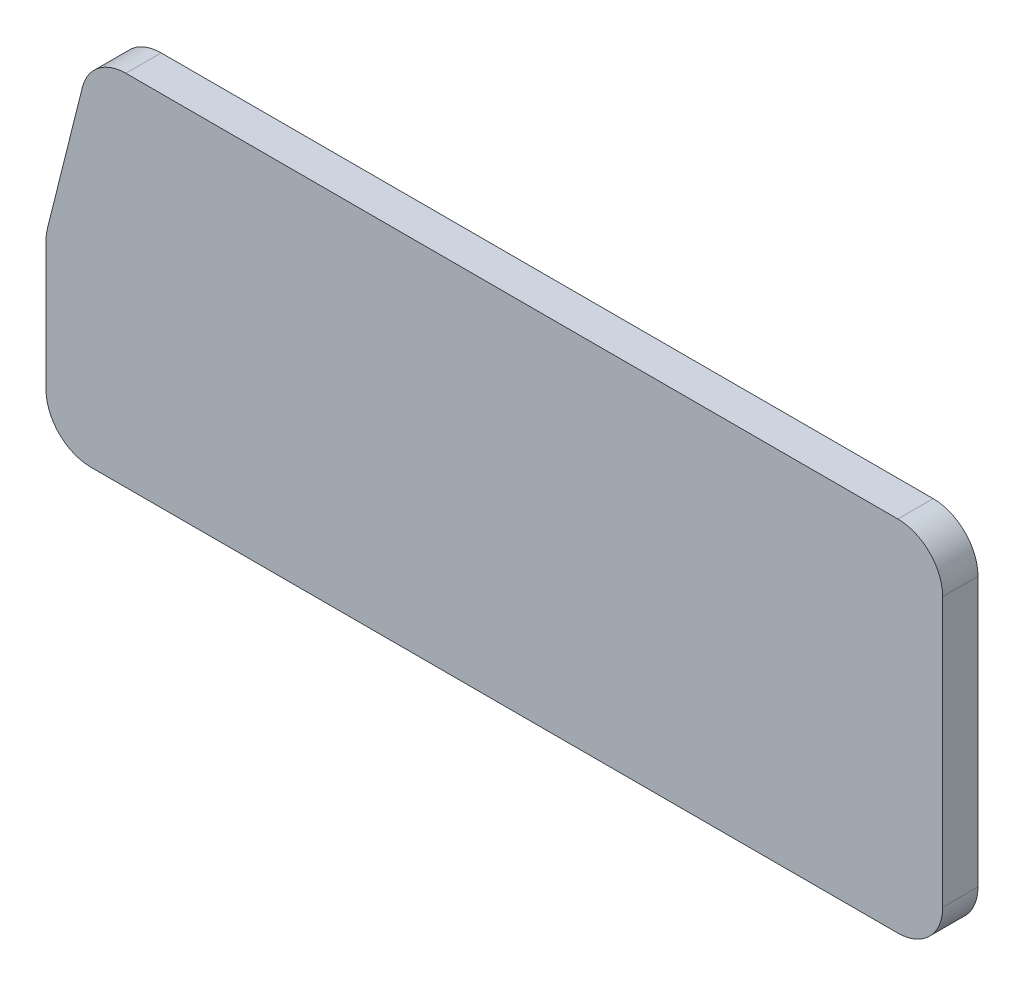
ISO-10303-21;
HEADER;
FILE_DESCRIPTION(('STEP AP214'),'2;1');
FILE_NAME('part.step','',(''),(''),'','','');
FILE_SCHEMA(('AUTOMOTIVE_DESIGN { 1 0 10303 214 1 1 1 1 }'));
ENDSEC;
DATA;
#1=APPLICATION_CONTEXT('core data for automotive mechanical design processes');
#2=APPLICATION_PROTOCOL_DEFINITION('international standard','automotive_design',2000,#1);
#3=PRODUCT_CONTEXT('',#1,'mechanical');
#4=PRODUCT('Part','Part','',(#3));
#5=PRODUCT_RELATED_PRODUCT_CATEGORY('part','',(#4));
#6=PRODUCT_DEFINITION_FORMATION('','',#4);
#7=PRODUCT_DEFINITION_CONTEXT('part definition',#1,'design');
#8=PRODUCT_DEFINITION('design','',#6,#7);
#9=PRODUCT_DEFINITION_SHAPE('','',#8);
#10=(LENGTH_UNIT() NAMED_UNIT(*) SI_UNIT(.MILLI.,.METRE.));
#11=(NAMED_UNIT(*) PLANE_ANGLE_UNIT() SI_UNIT($,.RADIAN.));
#12=(NAMED_UNIT(*) SI_UNIT($,.STERADIAN.) SOLID_ANGLE_UNIT());
#13=UNCERTAINTY_MEASURE_WITH_UNIT(LENGTH_MEASURE(1.E-05),#10,'distance_accuracy_value','');
#14=(GEOMETRIC_REPRESENTATION_CONTEXT(3) GLOBAL_UNCERTAINTY_ASSIGNED_CONTEXT((#13)) GLOBAL_UNIT_ASSIGNED_CONTEXT((#10,
#11,#12)) REPRESENTATION_CONTEXT('',''));
#15=CARTESIAN_POINT('',(0.,0.,0.));
#16=DIRECTION('',(0.,0.,1.));
#17=DIRECTION('',(1.,0.,0.));
#18=AXIS2_PLACEMENT_3D('',#15,#16,#17);
#19=CARTESIAN_POINT('',(63.5,-25.4,2.5));
#20=DIRECTION('',(-1.,0.,0.));
#21=DIRECTION('',(0.,0.,1.));
#22=AXIS2_PLACEMENT_3D('',#19,#20,#21);
#23=PLANE('',#22);
#24=DIRECTION('',(0.,1.,0.));
#25=VECTOR('',#24,1.);
#26=CARTESIAN_POINT('',(63.5,-25.4,-2.5));
#27=LINE('',#26,#25);
#28=CARTESIAN_POINT('',(63.5,-19.05,-2.5));
#29=VERTEX_POINT('',#28);
#30=CARTESIAN_POINT('',(63.5,19.05,-2.5));
#31=VERTEX_POINT('',#30);
#32=EDGE_CURVE('E142',#29,#31,#27,.T.);
#33=ORIENTED_EDGE('',*,*,#32,.T.);
#34=DIRECTION('',(0.,0.,-1.));
#35=VECTOR('',#34,1.);
#36=CARTESIAN_POINT('',(63.5,19.05,2.5));
#37=LINE('',#36,#35);
#38=CARTESIAN_POINT('',(63.5,19.05,2.5));
#39=VERTEX_POINT('',#38);
#40=EDGE_CURVE('E176',#31,#39,#37,.F.);
#41=ORIENTED_EDGE('',*,*,#40,.T.);
#42=DIRECTION('',(0.,1.,0.));
#43=VECTOR('',#42,1.);
#44=CARTESIAN_POINT('',(63.5,-25.4,2.5));
#45=LINE('',#44,#43);
#46=CARTESIAN_POINT('',(63.5,-19.05,2.5));
#47=VERTEX_POINT('',#46);
#48=EDGE_CURVE('E147',#47,#39,#45,.T.);
#49=ORIENTED_EDGE('',*,*,#48,.F.);
#50=DIRECTION('',(0.,0.,-1.));
#51=VECTOR('',#50,1.);
#52=CARTESIAN_POINT('',(63.5,-19.05,2.5));
#53=LINE('',#52,#51);
#54=EDGE_CURVE('E173',#47,#29,#53,.T.);
#55=ORIENTED_EDGE('',*,*,#54,.T.);
#56=EDGE_LOOP('',(#33,#41,#49,#55));
#57=FACE_BOUND('',#56,.T.);
#58=ADVANCED_FACE('F33',(#57),#23,.F.);
#59=CARTESIAN_POINT('',(-57.15,25.4,2.5));
#60=DIRECTION('',(0.,-1.,0.));
#61=DIRECTION('',(0.,0.,-1.));
#62=AXIS2_PLACEMENT_3D('',#59,#60,#61);
#63=PLANE('',#62);
#64=DIRECTION('',(-1.,0.,0.));
#65=VECTOR('',#64,1.);
#66=CARTESIAN_POINT('',(-57.15,25.4,-2.5));
#67=LINE('',#66,#65);
#68=CARTESIAN_POINT('',(57.15,25.4,-2.5));
#69=VERTEX_POINT('',#68);
#70=CARTESIAN_POINT('',(-52.1920698193319,25.4,-2.5));
#71=VERTEX_POINT('',#70);
#72=EDGE_CURVE('E137',#69,#71,#67,.T.);
#73=ORIENTED_EDGE('',*,*,#72,.T.);
#74=DIRECTION('',(0.,0.,-1.));
#75=VECTOR('',#74,1.);
#76=CARTESIAN_POINT('',(-52.1920698193319,25.4,2.5));
#77=LINE('',#76,#75);
#78=CARTESIAN_POINT('',(-52.1920698193319,25.4,2.5));
#79=VERTEX_POINT('',#78);
#80=EDGE_CURVE('E115',#71,#79,#77,.F.);
#81=ORIENTED_EDGE('',*,*,#80,.T.);
#82=DIRECTION('',(-1.,0.,0.));
#83=VECTOR('',#82,1.);
#84=CARTESIAN_POINT('',(-57.15,25.4,2.5));
#85=LINE('',#84,#83);
#86=CARTESIAN_POINT('',(57.15,25.4,2.5));
#87=VERTEX_POINT('',#86);
#88=EDGE_CURVE('E193',#87,#79,#85,.T.);
#89=ORIENTED_EDGE('',*,*,#88,.F.);
#90=DIRECTION('',(0.,0.,-1.));
#91=VECTOR('',#90,1.);
#92=CARTESIAN_POINT('',(57.15,25.4,2.5));
#93=LINE('',#92,#91);
#94=EDGE_CURVE('E120',#87,#69,#93,.T.);
#95=ORIENTED_EDGE('',*,*,#94,.T.);
#96=EDGE_LOOP('',(#73,#81,#89,#95));
#97=FACE_BOUND('',#96,.T.);
#98=ADVANCED_FACE('F213',(#97),#63,.F.);
#99=CARTESIAN_POINT('',(-63.5,-1.85788884277116E-12,2.5));
#100=DIRECTION('',(0.970142500145336,-0.242535625036315,0.));
#101=DIRECTION('',(0.242535625036315,0.970142500145336,0.));
#102=AXIS2_PLACEMENT_3D('',#99,#100,#101);
#103=PLANE('',#102);
#104=DIRECTION('',(-0.242535625036315,-0.970142500145336,0.));
#105=VECTOR('',#104,1.);
#106=CARTESIAN_POINT('',(-63.5,-1.85788884277116E-12,2.5));
#107=LINE('',#106,#105);
#108=CARTESIAN_POINT('',(-58.3524746952548,20.5901012189806,2.5));
#109=VERTEX_POINT('',#108);
#110=CARTESIAN_POINT('',(-63.3104048759229,0.758380496306668,2.5));
#111=VERTEX_POINT('',#110);
#112=EDGE_CURVE('E130',#109,#111,#107,.T.);
#113=ORIENTED_EDGE('',*,*,#112,.F.);
#114=DIRECTION('',(0.,0.,-1.));
#115=VECTOR('',#114,1.);
#116=CARTESIAN_POINT('',(-58.3524746952548,20.5901012189806,2.5));
#117=LINE('',#116,#115);
#118=CARTESIAN_POINT('',(-58.3524746952548,20.5901012189806,-2.5));
#119=VERTEX_POINT('',#118);
#120=EDGE_CURVE('E114',#109,#119,#117,.T.);
#121=ORIENTED_EDGE('',*,*,#120,.T.);
#122=DIRECTION('',(-0.242535625036315,-0.970142500145336,0.));
#123=VECTOR('',#122,1.);
#124=CARTESIAN_POINT('',(-63.5,-1.85788884277116E-12,-2.5));
#125=LINE('',#124,#123);
#126=CARTESIAN_POINT('',(-63.3104048759229,0.758380496306668,-2.5));
#127=VERTEX_POINT('',#126);
#128=EDGE_CURVE('E127',#119,#127,#125,.T.);
#129=ORIENTED_EDGE('',*,*,#128,.T.);
#130=DIRECTION('',(0.,0.,-1.));
#131=VECTOR('',#130,1.);
#132=CARTESIAN_POINT('',(-63.3104048759229,0.75838049630667,2.5));
#133=LINE('',#132,#131);
#134=EDGE_CURVE('E132',#127,#111,#133,.F.);
#135=ORIENTED_EDGE('',*,*,#134,.T.);
#136=EDGE_LOOP('',(#113,#121,#129,#135));
#137=FACE_BOUND('',#136,.T.);
#138=ADVANCED_FACE('F126',(#137),#103,.F.);
#139=CARTESIAN_POINT('',(-63.5,-25.4,2.5));
#140=DIRECTION('',(1.,0.,0.));
#141=DIRECTION('',(0.,1.,0.));
#142=AXIS2_PLACEMENT_3D('',#139,#140,#141);
#143=PLANE('',#142);
#144=DIRECTION('',(0.,-1.,0.));
#145=VECTOR('',#144,1.);
#146=CARTESIAN_POINT('',(-63.5,-25.4,2.5));
#147=LINE('',#146,#145);
#148=CARTESIAN_POINT('',(-63.5,-0.781720722673927,2.5));
#149=VERTEX_POINT('',#148);
#150=CARTESIAN_POINT('',(-63.5,-19.05,2.5));
#151=VERTEX_POINT('',#150);
#152=EDGE_CURVE('E199',#149,#151,#147,.T.);
#153=ORIENTED_EDGE('',*,*,#152,.F.);
#154=DIRECTION('',(0.,0.,-1.));
#155=VECTOR('',#154,1.);
#156=CARTESIAN_POINT('',(-63.5,-0.781720722673927,2.5));
#157=LINE('',#156,#155);
#158=CARTESIAN_POINT('',(-63.5,-0.781720722673927,-2.5));
#159=VERTEX_POINT('',#158);
#160=EDGE_CURVE('E170',#149,#159,#157,.T.);
#161=ORIENTED_EDGE('',*,*,#160,.T.);
#162=DIRECTION('',(0.,-1.,0.));
#163=VECTOR('',#162,1.);
#164=CARTESIAN_POINT('',(-63.5,-25.4,-2.5));
#165=LINE('',#164,#163);
#166=CARTESIAN_POINT('',(-63.5,-19.05,-2.5));
#167=VERTEX_POINT('',#166);
#168=EDGE_CURVE('E136',#159,#167,#165,.T.);
#169=ORIENTED_EDGE('',*,*,#168,.T.);
#170=DIRECTION('',(0.,0.,-1.));
#171=VECTOR('',#170,1.);
#172=CARTESIAN_POINT('',(-63.5,-19.05,2.5));
#173=LINE('',#172,#171);
#174=EDGE_CURVE('E168',#167,#151,#173,.F.);
#175=ORIENTED_EDGE('',*,*,#174,.T.);
#176=EDGE_LOOP('',(#153,#161,#169,#175));
#177=FACE_BOUND('',#176,.T.);
#178=ADVANCED_FACE('F210',(#177),#143,.F.);
#179=CARTESIAN_POINT('',(-63.5,-25.4,2.5));
#180=DIRECTION('',(0.,1.,0.));
#181=DIRECTION('',(0.,0.,1.));
#182=AXIS2_PLACEMENT_3D('',#179,#180,#181);
#183=PLANE('',#182);
#184=DIRECTION('',(1.,0.,0.));
#185=VECTOR('',#184,1.);
#186=CARTESIAN_POINT('',(-63.5,-25.4,-2.5));
#187=LINE('',#186,#185);
#188=CARTESIAN_POINT('',(-57.15,-25.4,-2.5));
#189=VERTEX_POINT('',#188);
#190=CARTESIAN_POINT('',(57.15,-25.4,-2.5));
#191=VERTEX_POINT('',#190);
#192=EDGE_CURVE('E140',#189,#191,#187,.T.);
#193=ORIENTED_EDGE('',*,*,#192,.T.);
#194=DIRECTION('',(0.,0.,-1.));
#195=VECTOR('',#194,1.);
#196=CARTESIAN_POINT('',(57.15,-25.4,2.5));
#197=LINE('',#196,#195);
#198=CARTESIAN_POINT('',(57.15,-25.4,2.5));
#199=VERTEX_POINT('',#198);
#200=EDGE_CURVE('E11',#191,#199,#197,.F.);
#201=ORIENTED_EDGE('',*,*,#200,.T.);
#202=DIRECTION('',(1.,0.,0.));
#203=VECTOR('',#202,1.);
#204=CARTESIAN_POINT('',(-63.5,-25.4,2.5));
#205=LINE('',#204,#203);
#206=CARTESIAN_POINT('',(-57.15,-25.4,2.5));
#207=VERTEX_POINT('',#206);
#208=EDGE_CURVE('E148',#207,#199,#205,.T.);
#209=ORIENTED_EDGE('',*,*,#208,.F.);
#210=DIRECTION('',(0.,0.,-1.));
#211=VECTOR('',#210,1.);
#212=CARTESIAN_POINT('',(-57.15,-25.4,2.5));
#213=LINE('',#212,#211);
#214=EDGE_CURVE('E41',#207,#189,#213,.T.);
#215=ORIENTED_EDGE('',*,*,#214,.T.);
#216=EDGE_LOOP('',(#193,#201,#209,#215));
#217=FACE_BOUND('',#216,.T.);
#218=ADVANCED_FACE('F180',(#217),#183,.F.);
#219=CARTESIAN_POINT('',(0.,0.,2.5));
#220=DIRECTION('',(0.,0.,-1.));
#221=DIRECTION('',(-1.,0.,0.));
#222=AXIS2_PLACEMENT_3D('',#219,#220,#221);
#223=PLANE('',#222);
#224=ORIENTED_EDGE('',*,*,#88,.T.);
#225=CARTESIAN_POINT('',(-52.1920698193319,19.05,2.5));
#226=DIRECTION('',(0.,0.,-1.));
#227=DIRECTION('',(-1.,0.,0.));
#228=AXIS2_PLACEMENT_3D('',#225,#226,#227);
#229=CIRCLE('',#228,6.35);
#230=EDGE_CURVE('E166',#79,#109,#229,.F.);
#231=ORIENTED_EDGE('',*,*,#230,.T.);
#232=ORIENTED_EDGE('',*,*,#112,.T.);
#233=CARTESIAN_POINT('',(-57.15,-0.781720722673934,2.5));
#234=DIRECTION('',(0.,0.,-1.));
#235=DIRECTION('',(-1.,0.,0.));
#236=AXIS2_PLACEMENT_3D('',#233,#234,#235);
#237=CIRCLE('',#236,6.35);
#238=EDGE_CURVE('E164',#111,#149,#237,.F.);
#239=ORIENTED_EDGE('',*,*,#238,.T.);
#240=ORIENTED_EDGE('',*,*,#152,.T.);
#241=CARTESIAN_POINT('',(-57.15,-19.05,2.5));
#242=DIRECTION('',(0.,0.,-1.));
#243=DIRECTION('',(-1.,0.,0.));
#244=AXIS2_PLACEMENT_3D('',#241,#242,#243);
#245=CIRCLE('',#244,6.35);
#246=EDGE_CURVE('E53',#151,#207,#245,.F.);
#247=ORIENTED_EDGE('',*,*,#246,.T.);
#248=ORIENTED_EDGE('',*,*,#208,.T.);
#249=CARTESIAN_POINT('',(57.15,-19.05,2.5));
#250=DIRECTION('',(0.,0.,-1.));
#251=DIRECTION('',(-1.,0.,0.));
#252=AXIS2_PLACEMENT_3D('',#249,#250,#251);
#253=CIRCLE('',#252,6.35);
#254=EDGE_CURVE('E160',#199,#47,#253,.F.);
#255=ORIENTED_EDGE('',*,*,#254,.T.);
#256=ORIENTED_EDGE('',*,*,#48,.T.);
#257=CARTESIAN_POINT('',(57.15,19.05,2.5));
#258=DIRECTION('',(0.,0.,-1.));
#259=DIRECTION('',(-1.,0.,0.));
#260=AXIS2_PLACEMENT_3D('',#257,#258,#259);
#261=CIRCLE('',#260,6.35);
#262=EDGE_CURVE('E162',#39,#87,#261,.F.);
#263=ORIENTED_EDGE('',*,*,#262,.T.);
#264=EDGE_LOOP('',(#224,#231,#232,#239,#240,#247,#248,#255,#256,#263));
#265=FACE_BOUND('',#264,.T.);
#266=ADVANCED_FACE('F201',(#265),#223,.F.);
#267=CARTESIAN_POINT('',(0.,0.,-2.5));
#268=DIRECTION('',(0.,0.,-1.));
#269=DIRECTION('',(-1.,0.,0.));
#270=AXIS2_PLACEMENT_3D('',#267,#268,#269);
#271=PLANE('',#270);
#272=ORIENTED_EDGE('',*,*,#128,.F.);
#273=CARTESIAN_POINT('',(-52.1920698193319,19.05,-2.5));
#274=DIRECTION('',(0.,0.,-1.));
#275=DIRECTION('',(-1.,0.,0.));
#276=AXIS2_PLACEMENT_3D('',#273,#274,#275);
#277=CIRCLE('',#276,6.35);
#278=EDGE_CURVE('E110',#119,#71,#277,.T.);
#279=ORIENTED_EDGE('',*,*,#278,.T.);
#280=ORIENTED_EDGE('',*,*,#72,.F.);
#281=CARTESIAN_POINT('',(57.15,19.05,-2.5));
#282=DIRECTION('',(0.,0.,-1.));
#283=DIRECTION('',(-1.,0.,0.));
#284=AXIS2_PLACEMENT_3D('',#281,#282,#283);
#285=CIRCLE('',#284,6.35);
#286=EDGE_CURVE('E153',#69,#31,#285,.T.);
#287=ORIENTED_EDGE('',*,*,#286,.T.);
#288=ORIENTED_EDGE('',*,*,#32,.F.);
#289=CARTESIAN_POINT('',(57.15,-19.05,-2.5));
#290=DIRECTION('',(0.,0.,-1.));
#291=DIRECTION('',(-1.,0.,0.));
#292=AXIS2_PLACEMENT_3D('',#289,#290,#291);
#293=CIRCLE('',#292,6.35);
#294=EDGE_CURVE('E151',#29,#191,#293,.T.);
#295=ORIENTED_EDGE('',*,*,#294,.T.);
#296=ORIENTED_EDGE('',*,*,#192,.F.);
#297=CARTESIAN_POINT('',(-57.15,-19.05,-2.5));
#298=DIRECTION('',(0.,0.,-1.));
#299=DIRECTION('',(-1.,0.,0.));
#300=AXIS2_PLACEMENT_3D('',#297,#298,#299);
#301=CIRCLE('',#300,6.35);
#302=EDGE_CURVE('E131',#189,#167,#301,.T.);
#303=ORIENTED_EDGE('',*,*,#302,.T.);
#304=ORIENTED_EDGE('',*,*,#168,.F.);
#305=CARTESIAN_POINT('',(-57.15,-0.781720722673934,-2.5));
#306=DIRECTION('',(0.,0.,-1.));
#307=DIRECTION('',(-1.,0.,0.));
#308=AXIS2_PLACEMENT_3D('',#305,#306,#307);
#309=CIRCLE('',#308,6.35);
#310=EDGE_CURVE('E121',#159,#127,#309,.T.);
#311=ORIENTED_EDGE('',*,*,#310,.T.);
#312=EDGE_LOOP('',(#272,#279,#280,#287,#288,#295,#296,#303,#304,#311));
#313=FACE_BOUND('',#312,.T.);
#314=ADVANCED_FACE('F134',(#313),#271,.T.);
#315=CARTESIAN_POINT('',(-52.1920698193319,19.05,2.5));
#316=DIRECTION('',(0.,0.,-1.));
#317=DIRECTION('',(-1.,0.,0.));
#318=AXIS2_PLACEMENT_3D('',#315,#316,#317);
#319=CYLINDRICAL_SURFACE('',#318,6.35);
#320=ORIENTED_EDGE('',*,*,#230,.F.);
#321=ORIENTED_EDGE('',*,*,#80,.F.);
#322=ORIENTED_EDGE('',*,*,#278,.F.);
#323=ORIENTED_EDGE('',*,*,#120,.F.);
#324=EDGE_LOOP('',(#320,#321,#322,#323));
#325=FACE_BOUND('',#324,.T.);
#326=ADVANCED_FACE('F113',(#325),#319,.T.);
#327=CARTESIAN_POINT('',(-57.15,-0.781720722673934,2.5));
#328=DIRECTION('',(0.,0.,-1.));
#329=DIRECTION('',(-1.,0.,0.));
#330=AXIS2_PLACEMENT_3D('',#327,#328,#329);
#331=CYLINDRICAL_SURFACE('',#330,6.35);
#332=ORIENTED_EDGE('',*,*,#238,.F.);
#333=ORIENTED_EDGE('',*,*,#134,.F.);
#334=ORIENTED_EDGE('',*,*,#310,.F.);
#335=ORIENTED_EDGE('',*,*,#160,.F.);
#336=EDGE_LOOP('',(#332,#333,#334,#335));
#337=FACE_BOUND('',#336,.T.);
#338=ADVANCED_FACE('F224',(#337),#331,.T.);
#339=CARTESIAN_POINT('',(57.15,19.05,2.5));
#340=DIRECTION('',(0.,0.,-1.));
#341=DIRECTION('',(-1.,0.,0.));
#342=AXIS2_PLACEMENT_3D('',#339,#340,#341);
#343=CYLINDRICAL_SURFACE('',#342,6.35);
#344=ORIENTED_EDGE('',*,*,#262,.F.);
#345=ORIENTED_EDGE('',*,*,#40,.F.);
#346=ORIENTED_EDGE('',*,*,#286,.F.);
#347=ORIENTED_EDGE('',*,*,#94,.F.);
#348=EDGE_LOOP('',(#344,#345,#346,#347));
#349=FACE_BOUND('',#348,.T.);
#350=ADVANCED_FACE('F227',(#349),#343,.T.);
#351=CARTESIAN_POINT('',(57.15,-19.05,2.5));
#352=DIRECTION('',(0.,0.,-1.));
#353=DIRECTION('',(-1.,0.,0.));
#354=AXIS2_PLACEMENT_3D('',#351,#352,#353);
#355=CYLINDRICAL_SURFACE('',#354,6.35);
#356=ORIENTED_EDGE('',*,*,#254,.F.);
#357=ORIENTED_EDGE('',*,*,#200,.F.);
#358=ORIENTED_EDGE('',*,*,#294,.F.);
#359=ORIENTED_EDGE('',*,*,#54,.F.);
#360=EDGE_LOOP('',(#356,#357,#358,#359));
#361=FACE_BOUND('',#360,.T.);
#362=ADVANCED_FACE('F187',(#361),#355,.T.);
#363=CARTESIAN_POINT('',(-57.15,-19.05,2.5));
#364=DIRECTION('',(0.,0.,-1.));
#365=DIRECTION('',(-1.,0.,0.));
#366=AXIS2_PLACEMENT_3D('',#363,#364,#365);
#367=CYLINDRICAL_SURFACE('',#366,6.35);
#368=ORIENTED_EDGE('',*,*,#246,.F.);
#369=ORIENTED_EDGE('',*,*,#174,.F.);
#370=ORIENTED_EDGE('',*,*,#302,.F.);
#371=ORIENTED_EDGE('',*,*,#214,.F.);
#372=EDGE_LOOP('',(#368,#369,#370,#371));
#373=FACE_BOUND('',#372,.T.);
#374=ADVANCED_FACE('F35',(#373),#367,.T.);
#375=CLOSED_SHELL('',(#58,#98,#138,#178,#218,#266,#314,#326,#338,#350,#362,#374));
#376=MANIFOLD_SOLID_BREP('B2',#375);
#377=ADVANCED_BREP_SHAPE_REPRESENTATION('',(#18,#376),#14);
#378=SHAPE_DEFINITION_REPRESENTATION(#9,#377);
ENDSEC;
END-ISO-10303-21;
